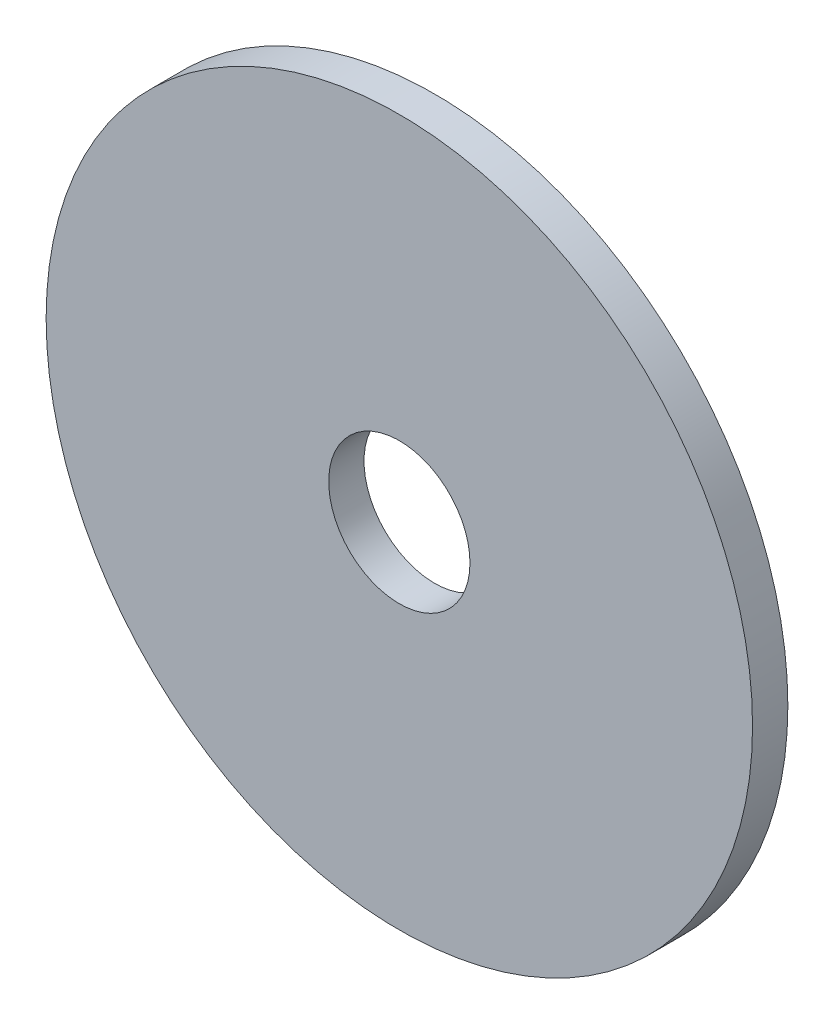
ISO-10303-21;
HEADER;
FILE_DESCRIPTION(('STEP AP214'),'2;1');
FILE_NAME('part.step','',(''),(''),'','','');
FILE_SCHEMA(('AUTOMOTIVE_DESIGN { 1 0 10303 214 1 1 1 1 }'));
ENDSEC;
DATA;
#1=APPLICATION_CONTEXT('core data for automotive mechanical design processes');
#2=APPLICATION_PROTOCOL_DEFINITION('international standard','automotive_design',2000,#1);
#3=PRODUCT_CONTEXT('',#1,'mechanical');
#4=PRODUCT('Part','Part','',(#3));
#5=PRODUCT_RELATED_PRODUCT_CATEGORY('part','',(#4));
#6=PRODUCT_DEFINITION_FORMATION('','',#4);
#7=PRODUCT_DEFINITION_CONTEXT('part definition',#1,'design');
#8=PRODUCT_DEFINITION('design','',#6,#7);
#9=PRODUCT_DEFINITION_SHAPE('','',#8);
#10=(LENGTH_UNIT() NAMED_UNIT(*) SI_UNIT(.MILLI.,.METRE.));
#11=(NAMED_UNIT(*) PLANE_ANGLE_UNIT() SI_UNIT($,.RADIAN.));
#12=(NAMED_UNIT(*) SI_UNIT($,.STERADIAN.) SOLID_ANGLE_UNIT());
#13=UNCERTAINTY_MEASURE_WITH_UNIT(LENGTH_MEASURE(1.E-05),#10,'distance_accuracy_value','');
#14=(GEOMETRIC_REPRESENTATION_CONTEXT(3) GLOBAL_UNCERTAINTY_ASSIGNED_CONTEXT((#13)) GLOBAL_UNIT_ASSIGNED_CONTEXT((#10,
#11,#12)) REPRESENTATION_CONTEXT('',''));
#15=CARTESIAN_POINT('',(0.,0.,0.));
#16=DIRECTION('',(0.,0.,1.));
#17=DIRECTION('',(1.,0.,0.));
#18=AXIS2_PLACEMENT_3D('',#15,#16,#17);
#19=CARTESIAN_POINT('',(0.,0.,5.));
#20=DIRECTION('',(0.,0.,1.));
#21=DIRECTION('',(1.,0.,0.));
#22=AXIS2_PLACEMENT_3D('',#19,#20,#21);
#23=PLANE('',#22);
#24=CARTESIAN_POINT('',(0.,0.,5.));
#25=DIRECTION('',(0.,0.,1.));
#26=DIRECTION('',(1.,0.,0.));
#27=AXIS2_PLACEMENT_3D('',#24,#25,#26);
#28=CIRCLE('',#27,50.);
#29=CARTESIAN_POINT('',(50.,0.,5.));
#30=VERTEX_POINT('',#29);
#31=EDGE_CURVE('E10',#30,#30,#28,.T.);
#32=ORIENTED_EDGE('',*,*,#31,.T.);
#33=EDGE_LOOP('',(#32));
#34=FACE_BOUND('',#33,.T.);
#35=CARTESIAN_POINT('',(0.,0.,5.));
#36=DIRECTION('',(0.,0.,1.));
#37=DIRECTION('',(1.,0.,0.));
#38=AXIS2_PLACEMENT_3D('',#35,#36,#37);
#39=CIRCLE('',#38,10.);
#40=CARTESIAN_POINT('',(10.,0.,5.));
#41=VERTEX_POINT('',#40);
#42=EDGE_CURVE('E51',#41,#41,#39,.T.);
#43=ORIENTED_EDGE('',*,*,#42,.F.);
#44=EDGE_LOOP('',(#43));
#45=FACE_BOUND('',#44,.T.);
#46=ADVANCED_FACE('F40',(#34,#45),#23,.T.);
#47=CARTESIAN_POINT('',(0.,0.,0.));
#48=DIRECTION('',(0.,0.,1.));
#49=DIRECTION('',(1.,0.,0.));
#50=AXIS2_PLACEMENT_3D('',#47,#48,#49);
#51=PLANE('',#50);
#52=CARTESIAN_POINT('',(0.,0.,0.));
#53=DIRECTION('',(0.,0.,1.));
#54=DIRECTION('',(1.,0.,0.));
#55=AXIS2_PLACEMENT_3D('',#52,#53,#54);
#56=CIRCLE('',#55,50.);
#57=CARTESIAN_POINT('',(50.,0.,0.));
#58=VERTEX_POINT('',#57);
#59=EDGE_CURVE('E44',#58,#58,#56,.T.);
#60=ORIENTED_EDGE('',*,*,#59,.F.);
#61=EDGE_LOOP('',(#60));
#62=FACE_BOUND('',#61,.T.);
#63=CARTESIAN_POINT('',(0.,0.,0.));
#64=DIRECTION('',(0.,0.,1.));
#65=DIRECTION('',(1.,0.,0.));
#66=AXIS2_PLACEMENT_3D('',#63,#64,#65);
#67=CIRCLE('',#66,10.);
#68=CARTESIAN_POINT('',(10.,0.,0.));
#69=VERTEX_POINT('',#68);
#70=EDGE_CURVE('E53',#69,#69,#67,.T.);
#71=ORIENTED_EDGE('',*,*,#70,.T.);
#72=EDGE_LOOP('',(#71));
#73=FACE_BOUND('',#72,.T.);
#74=ADVANCED_FACE('F63',(#62,#73),#51,.F.);
#75=CARTESIAN_POINT('',(0.,0.,5.));
#76=DIRECTION('',(0.,0.,-1.));
#77=DIRECTION('',(-1.,0.,0.));
#78=AXIS2_PLACEMENT_3D('',#75,#76,#77);
#79=CYLINDRICAL_SURFACE('',#78,50.);
#80=ORIENTED_EDGE('',*,*,#31,.F.);
#81=EDGE_LOOP('',(#80));
#82=FACE_BOUND('',#81,.T.);
#83=ORIENTED_EDGE('',*,*,#59,.T.);
#84=EDGE_LOOP('',(#83));
#85=FACE_BOUND('',#84,.T.);
#86=ADVANCED_FACE('F42',(#82,#85),#79,.T.);
#87=CARTESIAN_POINT('',(0.,0.,5.));
#88=DIRECTION('',(0.,0.,-1.));
#89=DIRECTION('',(-1.,0.,0.));
#90=AXIS2_PLACEMENT_3D('',#87,#88,#89);
#91=CYLINDRICAL_SURFACE('',#90,10.);
#92=ORIENTED_EDGE('',*,*,#42,.T.);
#93=EDGE_LOOP('',(#92));
#94=FACE_BOUND('',#93,.T.);
#95=ORIENTED_EDGE('',*,*,#70,.F.);
#96=EDGE_LOOP('',(#95));
#97=FACE_BOUND('',#96,.T.);
#98=ADVANCED_FACE('F59',(#94,#97),#91,.F.);
#99=CLOSED_SHELL('',(#46,#74,#86,#98));
#100=MANIFOLD_SOLID_BREP('B2',#99);
#101=ADVANCED_BREP_SHAPE_REPRESENTATION('',(#18,#100),#14);
#102=SHAPE_DEFINITION_REPRESENTATION(#9,#101);
ENDSEC;
END-ISO-10303-21;
